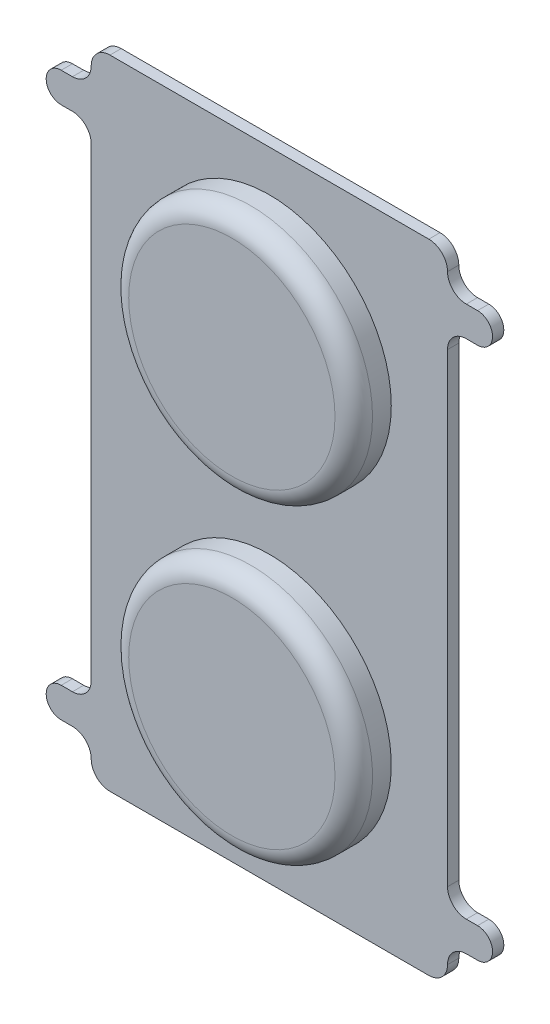
ISO-10303-21;
HEADER;
FILE_DESCRIPTION(('STEP AP214'),'2;1');
FILE_NAME('part.step','',(''),(''),'','','');
FILE_SCHEMA(('AUTOMOTIVE_DESIGN { 1 0 10303 214 1 1 1 1 }'));
ENDSEC;
DATA;
#1=APPLICATION_CONTEXT('core data for automotive mechanical design processes');
#2=APPLICATION_PROTOCOL_DEFINITION('international standard','automotive_design',2000,#1);
#3=PRODUCT_CONTEXT('',#1,'mechanical');
#4=PRODUCT('Part','Part','',(#3));
#5=PRODUCT_RELATED_PRODUCT_CATEGORY('part','',(#4));
#6=PRODUCT_DEFINITION_FORMATION('','',#4);
#7=PRODUCT_DEFINITION_CONTEXT('part definition',#1,'design');
#8=PRODUCT_DEFINITION('design','',#6,#7);
#9=PRODUCT_DEFINITION_SHAPE('','',#8);
#10=(LENGTH_UNIT() NAMED_UNIT(*) SI_UNIT(.MILLI.,.METRE.));
#11=(NAMED_UNIT(*) PLANE_ANGLE_UNIT() SI_UNIT($,.RADIAN.));
#12=(NAMED_UNIT(*) SI_UNIT($,.STERADIAN.) SOLID_ANGLE_UNIT());
#13=UNCERTAINTY_MEASURE_WITH_UNIT(LENGTH_MEASURE(1.E-05),#10,'distance_accuracy_value','');
#14=(GEOMETRIC_REPRESENTATION_CONTEXT(3) GLOBAL_UNCERTAINTY_ASSIGNED_CONTEXT((#13)) GLOBAL_UNIT_ASSIGNED_CONTEXT((#10,
#11,#12)) REPRESENTATION_CONTEXT('',''));
#15=CARTESIAN_POINT('',(0.,0.,0.));
#16=DIRECTION('',(0.,0.,1.));
#17=DIRECTION('',(1.,0.,0.));
#18=AXIS2_PLACEMENT_3D('',#15,#16,#17);
#19=CARTESIAN_POINT('',(-55.5,75.,3.));
#20=DIRECTION('',(0.,-1.,0.));
#21=DIRECTION('',(0.,0.,-1.));
#22=AXIS2_PLACEMENT_3D('',#19,#20,#21);
#23=PLANE('',#22);
#24=DIRECTION('',(-1.,0.,0.));
#25=VECTOR('',#24,1.);
#26=CARTESIAN_POINT('',(-55.5,75.,3.));
#27=LINE('',#26,#25);
#28=CARTESIAN_POINT('',(-52.5,75.,3.));
#29=VERTEX_POINT('',#28);
#30=CARTESIAN_POINT('',(-55.5,75.,3.));
#31=VERTEX_POINT('',#30);
#32=EDGE_CURVE('E222',#29,#31,#27,.T.);
#33=ORIENTED_EDGE('',*,*,#32,.F.);
#34=DIRECTION('',(0.,0.,-1.));
#35=VECTOR('',#34,1.);
#36=CARTESIAN_POINT('',(-52.5,75.,0.));
#37=LINE('',#36,#35);
#38=CARTESIAN_POINT('',(-52.5,75.,0.));
#39=VERTEX_POINT('',#38);
#40=EDGE_CURVE('E354',#29,#39,#37,.T.);
#41=ORIENTED_EDGE('',*,*,#40,.T.);
#42=DIRECTION('',(-1.,0.,0.));
#43=VECTOR('',#42,1.);
#44=CARTESIAN_POINT('',(-55.5,75.,0.));
#45=LINE('',#44,#43);
#46=CARTESIAN_POINT('',(-55.5,75.,0.));
#47=VERTEX_POINT('',#46);
#48=EDGE_CURVE('E240',#39,#47,#45,.T.);
#49=ORIENTED_EDGE('',*,*,#48,.T.);
#50=DIRECTION('',(0.,0.,-1.));
#51=VECTOR('',#50,1.);
#52=CARTESIAN_POINT('',(-55.5,75.,3.));
#53=LINE('',#52,#51);
#54=EDGE_CURVE('E238',#31,#47,#53,.T.);
#55=ORIENTED_EDGE('',*,*,#54,.F.);
#56=EDGE_LOOP('',(#33,#41,#49,#55));
#57=FACE_BOUND('',#56,.T.);
#58=ADVANCED_FACE('F38',(#57),#23,.F.);
#59=CARTESIAN_POINT('',(-55.5,71.,3.));
#60=DIRECTION('',(0.,0.,-1.));
#61=DIRECTION('',(-1.,0.,0.));
#62=AXIS2_PLACEMENT_3D('',#59,#60,#61);
#63=CYLINDRICAL_SURFACE('',#62,4.);
#64=CARTESIAN_POINT('',(-55.5,71.,0.));
#65=DIRECTION('',(0.,0.,1.));
#66=DIRECTION('',(-1.,0.,0.));
#67=AXIS2_PLACEMENT_3D('',#64,#65,#66);
#68=CIRCLE('',#67,4.);
#69=CARTESIAN_POINT('',(-55.5,67.,0.));
#70=VERTEX_POINT('',#69);
#71=EDGE_CURVE('E287',#47,#70,#68,.T.);
#72=ORIENTED_EDGE('',*,*,#71,.T.);
#73=DIRECTION('',(0.,0.,-1.));
#74=VECTOR('',#73,1.);
#75=CARTESIAN_POINT('',(-55.5,67.,3.));
#76=LINE('',#75,#74);
#77=CARTESIAN_POINT('',(-55.5,67.,3.));
#78=VERTEX_POINT('',#77);
#79=EDGE_CURVE('E244',#78,#70,#76,.T.);
#80=ORIENTED_EDGE('',*,*,#79,.F.);
#81=CARTESIAN_POINT('',(-55.5,71.,3.));
#82=DIRECTION('',(0.,0.,1.));
#83=DIRECTION('',(-1.,0.,0.));
#84=AXIS2_PLACEMENT_3D('',#81,#82,#83);
#85=CIRCLE('',#84,4.);
#86=EDGE_CURVE('E228',#31,#78,#85,.T.);
#87=ORIENTED_EDGE('',*,*,#86,.F.);
#88=ORIENTED_EDGE('',*,*,#54,.T.);
#89=EDGE_LOOP('',(#72,#80,#87,#88));
#90=FACE_BOUND('',#89,.T.);
#91=ADVANCED_FACE('F246',(#90),#63,.T.);
#92=CARTESIAN_POINT('',(-55.5,67.,3.));
#93=DIRECTION('',(0.,1.,0.));
#94=DIRECTION('',(0.,0.,1.));
#95=AXIS2_PLACEMENT_3D('',#92,#93,#94);
#96=PLANE('',#95);
#97=DIRECTION('',(1.,0.,0.));
#98=VECTOR('',#97,1.);
#99=CARTESIAN_POINT('',(-55.5,67.,0.));
#100=LINE('',#99,#98);
#101=CARTESIAN_POINT('',(-52.5,67.,0.));
#102=VERTEX_POINT('',#101);
#103=EDGE_CURVE('E290',#70,#102,#100,.T.);
#104=ORIENTED_EDGE('',*,*,#103,.T.);
#105=DIRECTION('',(0.,0.,-1.));
#106=VECTOR('',#105,1.);
#107=CARTESIAN_POINT('',(-52.5,67.,3.));
#108=LINE('',#107,#106);
#109=CARTESIAN_POINT('',(-52.5,67.,3.));
#110=VERTEX_POINT('',#109);
#111=EDGE_CURVE('E352',#102,#110,#108,.F.);
#112=ORIENTED_EDGE('',*,*,#111,.T.);
#113=DIRECTION('',(1.,0.,0.));
#114=VECTOR('',#113,1.);
#115=CARTESIAN_POINT('',(-55.5,67.,3.));
#116=LINE('',#115,#114);
#117=EDGE_CURVE('E249',#78,#110,#116,.T.);
#118=ORIENTED_EDGE('',*,*,#117,.F.);
#119=ORIENTED_EDGE('',*,*,#79,.T.);
#120=EDGE_LOOP('',(#104,#112,#118,#119));
#121=FACE_BOUND('',#120,.T.);
#122=ADVANCED_FACE('F464',(#121),#96,.F.);
#123=CARTESIAN_POINT('',(-47.5,67.,3.));
#124=DIRECTION('',(1.,0.,0.));
#125=DIRECTION('',(0.,0.,-1.));
#126=AXIS2_PLACEMENT_3D('',#123,#124,#125);
#127=PLANE('',#126);
#128=DIRECTION('',(0.,-1.,0.));
#129=VECTOR('',#128,1.);
#130=CARTESIAN_POINT('',(-47.5,67.,0.));
#131=LINE('',#130,#129);
#132=CARTESIAN_POINT('',(-47.5,62.,0.));
#133=VERTEX_POINT('',#132);
#134=CARTESIAN_POINT('',(-47.5,-62.,0.));
#135=VERTEX_POINT('',#134);
#136=EDGE_CURVE('E293',#133,#135,#131,.T.);
#137=ORIENTED_EDGE('',*,*,#136,.T.);
#138=DIRECTION('',(0.,0.,-1.));
#139=VECTOR('',#138,1.);
#140=CARTESIAN_POINT('',(-47.5,-62.,3.));
#141=LINE('',#140,#139);
#142=CARTESIAN_POINT('',(-47.5,-62.,3.));
#143=VERTEX_POINT('',#142);
#144=EDGE_CURVE('E347',#135,#143,#141,.F.);
#145=ORIENTED_EDGE('',*,*,#144,.T.);
#146=DIRECTION('',(0.,-1.,0.));
#147=VECTOR('',#146,1.);
#148=CARTESIAN_POINT('',(-47.5,67.,3.));
#149=LINE('',#148,#147);
#150=CARTESIAN_POINT('',(-47.5,62.,3.));
#151=VERTEX_POINT('',#150);
#152=EDGE_CURVE('E251',#151,#143,#149,.T.);
#153=ORIENTED_EDGE('',*,*,#152,.F.);
#154=DIRECTION('',(0.,0.,-1.));
#155=VECTOR('',#154,1.);
#156=CARTESIAN_POINT('',(-47.5,62.,0.));
#157=LINE('',#156,#155);
#158=EDGE_CURVE('E344',#151,#133,#157,.T.);
#159=ORIENTED_EDGE('',*,*,#158,.T.);
#160=EDGE_LOOP('',(#137,#145,#153,#159));
#161=FACE_BOUND('',#160,.T.);
#162=ADVANCED_FACE('F581',(#161),#127,.F.);
#163=CARTESIAN_POINT('',(-55.5,-67.,3.));
#164=DIRECTION('',(0.,-1.,0.));
#165=DIRECTION('',(0.,0.,-1.));
#166=AXIS2_PLACEMENT_3D('',#163,#164,#165);
#167=PLANE('',#166);
#168=DIRECTION('',(-1.,0.,0.));
#169=VECTOR('',#168,1.);
#170=CARTESIAN_POINT('',(-55.5,-67.,3.));
#171=LINE('',#170,#169);
#172=CARTESIAN_POINT('',(-52.5,-67.,3.));
#173=VERTEX_POINT('',#172);
#174=CARTESIAN_POINT('',(-55.5,-67.,3.));
#175=VERTEX_POINT('',#174);
#176=EDGE_CURVE('E257',#173,#175,#171,.T.);
#177=ORIENTED_EDGE('',*,*,#176,.F.);
#178=DIRECTION('',(0.,0.,-1.));
#179=VECTOR('',#178,1.);
#180=CARTESIAN_POINT('',(-52.5,-67.,0.));
#181=LINE('',#180,#179);
#182=CARTESIAN_POINT('',(-52.5,-67.,0.));
#183=VERTEX_POINT('',#182);
#184=EDGE_CURVE('E243',#173,#183,#181,.T.);
#185=ORIENTED_EDGE('',*,*,#184,.T.);
#186=DIRECTION('',(-1.,0.,0.));
#187=VECTOR('',#186,1.);
#188=CARTESIAN_POINT('',(-55.5,-67.,0.));
#189=LINE('',#188,#187);
#190=CARTESIAN_POINT('',(-55.5,-67.,0.));
#191=VERTEX_POINT('',#190);
#192=EDGE_CURVE('E296',#183,#191,#189,.T.);
#193=ORIENTED_EDGE('',*,*,#192,.T.);
#194=DIRECTION('',(0.,0.,-1.));
#195=VECTOR('',#194,1.);
#196=CARTESIAN_POINT('',(-55.5,-67.,3.));
#197=LINE('',#196,#195);
#198=EDGE_CURVE('E338',#175,#191,#197,.T.);
#199=ORIENTED_EDGE('',*,*,#198,.F.);
#200=EDGE_LOOP('',(#177,#185,#193,#199));
#201=FACE_BOUND('',#200,.T.);
#202=ADVANCED_FACE('F589',(#201),#167,.F.);
#203=CARTESIAN_POINT('',(-55.5,-71.,3.));
#204=DIRECTION('',(0.,0.,-1.));
#205=DIRECTION('',(-1.,0.,0.));
#206=AXIS2_PLACEMENT_3D('',#203,#204,#205);
#207=CYLINDRICAL_SURFACE('',#206,4.);
#208=CARTESIAN_POINT('',(-55.5,-71.,0.));
#209=DIRECTION('',(0.,0.,1.));
#210=DIRECTION('',(1.,0.,0.));
#211=AXIS2_PLACEMENT_3D('',#208,#209,#210);
#212=CIRCLE('',#211,4.);
#213=CARTESIAN_POINT('',(-55.5,-75.,0.));
#214=VERTEX_POINT('',#213);
#215=EDGE_CURVE('E298',#191,#214,#212,.T.);
#216=ORIENTED_EDGE('',*,*,#215,.T.);
#217=DIRECTION('',(0.,0.,-1.));
#218=VECTOR('',#217,1.);
#219=CARTESIAN_POINT('',(-55.5,-75.,3.));
#220=LINE('',#219,#218);
#221=CARTESIAN_POINT('',(-55.5,-75.,3.));
#222=VERTEX_POINT('',#221);
#223=EDGE_CURVE('E335',#222,#214,#220,.T.);
#224=ORIENTED_EDGE('',*,*,#223,.F.);
#225=CARTESIAN_POINT('',(-55.5,-71.,3.));
#226=DIRECTION('',(0.,0.,1.));
#227=DIRECTION('',(1.,0.,0.));
#228=AXIS2_PLACEMENT_3D('',#225,#226,#227);
#229=CIRCLE('',#228,4.);
#230=EDGE_CURVE('E259',#175,#222,#229,.T.);
#231=ORIENTED_EDGE('',*,*,#230,.F.);
#232=ORIENTED_EDGE('',*,*,#198,.T.);
#233=EDGE_LOOP('',(#216,#224,#231,#232));
#234=FACE_BOUND('',#233,.T.);
#235=ADVANCED_FACE('F595',(#234),#207,.T.);
#236=CARTESIAN_POINT('',(-55.5,-75.,3.));
#237=DIRECTION('',(0.,1.,0.));
#238=DIRECTION('',(0.,0.,1.));
#239=AXIS2_PLACEMENT_3D('',#236,#237,#238);
#240=PLANE('',#239);
#241=DIRECTION('',(1.,0.,0.));
#242=VECTOR('',#241,1.);
#243=CARTESIAN_POINT('',(-55.5,-75.,0.));
#244=LINE('',#243,#242);
#245=CARTESIAN_POINT('',(-52.5,-75.,0.));
#246=VERTEX_POINT('',#245);
#247=EDGE_CURVE('E300',#214,#246,#244,.T.);
#248=ORIENTED_EDGE('',*,*,#247,.T.);
#249=DIRECTION('',(0.,0.,-1.));
#250=VECTOR('',#249,1.);
#251=CARTESIAN_POINT('',(-52.5,-75.,3.));
#252=LINE('',#251,#250);
#253=CARTESIAN_POINT('',(-52.5,-75.,3.));
#254=VERTEX_POINT('',#253);
#255=EDGE_CURVE('E349',#246,#254,#252,.F.);
#256=ORIENTED_EDGE('',*,*,#255,.T.);
#257=DIRECTION('',(1.,0.,0.));
#258=VECTOR('',#257,1.);
#259=CARTESIAN_POINT('',(-55.5,-75.,3.));
#260=LINE('',#259,#258);
#261=EDGE_CURVE('E261',#222,#254,#260,.T.);
#262=ORIENTED_EDGE('',*,*,#261,.F.);
#263=ORIENTED_EDGE('',*,*,#223,.T.);
#264=EDGE_LOOP('',(#248,#256,#262,#263));
#265=FACE_BOUND('',#264,.T.);
#266=ADVANCED_FACE('F598',(#265),#240,.F.);
#267=CARTESIAN_POINT('',(-47.5,-85.,3.));
#268=DIRECTION('',(0.,1.,0.));
#269=DIRECTION('',(0.,0.,1.));
#270=AXIS2_PLACEMENT_3D('',#267,#268,#269);
#271=PLANE('',#270);
#272=DIRECTION('',(1.,0.,0.));
#273=VECTOR('',#272,1.);
#274=CARTESIAN_POINT('',(-47.5,-85.,0.));
#275=LINE('',#274,#273);
#276=CARTESIAN_POINT('',(-42.5,-85.,0.));
#277=VERTEX_POINT('',#276);
#278=CARTESIAN_POINT('',(42.5,-85.,0.));
#279=VERTEX_POINT('',#278);
#280=EDGE_CURVE('E303',#277,#279,#275,.T.);
#281=ORIENTED_EDGE('',*,*,#280,.T.);
#282=DIRECTION('',(0.,0.,-1.));
#283=VECTOR('',#282,1.);
#284=CARTESIAN_POINT('',(42.5,-85.,3.));
#285=LINE('',#284,#283);
#286=CARTESIAN_POINT('',(42.5,-85.,3.));
#287=VERTEX_POINT('',#286);
#288=EDGE_CURVE('E382',#279,#287,#285,.F.);
#289=ORIENTED_EDGE('',*,*,#288,.T.);
#290=DIRECTION('',(1.,0.,0.));
#291=VECTOR('',#290,1.);
#292=CARTESIAN_POINT('',(-47.5,-85.,3.));
#293=LINE('',#292,#291);
#294=CARTESIAN_POINT('',(-42.5,-85.,3.));
#295=VERTEX_POINT('',#294);
#296=EDGE_CURVE('E264',#295,#287,#293,.T.);
#297=ORIENTED_EDGE('',*,*,#296,.F.);
#298=DIRECTION('',(0.,0.,-1.));
#299=VECTOR('',#298,1.);
#300=CARTESIAN_POINT('',(-42.5,-85.,3.));
#301=LINE('',#300,#299);
#302=EDGE_CURVE('E380',#295,#277,#301,.T.);
#303=ORIENTED_EDGE('',*,*,#302,.T.);
#304=EDGE_LOOP('',(#281,#289,#297,#303));
#305=FACE_BOUND('',#304,.T.);
#306=ADVANCED_FACE('F608',(#305),#271,.F.);
#307=CARTESIAN_POINT('',(55.5,-75.,3.));
#308=DIRECTION('',(0.,1.,0.));
#309=DIRECTION('',(0.,0.,1.));
#310=AXIS2_PLACEMENT_3D('',#307,#308,#309);
#311=PLANE('',#310);
#312=DIRECTION('',(1.,0.,0.));
#313=VECTOR('',#312,1.);
#314=CARTESIAN_POINT('',(55.5,-75.,3.));
#315=LINE('',#314,#313);
#316=CARTESIAN_POINT('',(52.5,-75.,3.));
#317=VERTEX_POINT('',#316);
#318=CARTESIAN_POINT('',(55.5,-75.,3.));
#319=VERTEX_POINT('',#318);
#320=EDGE_CURVE('E266',#317,#319,#315,.T.);
#321=ORIENTED_EDGE('',*,*,#320,.F.);
#322=DIRECTION('',(0.,0.,-1.));
#323=VECTOR('',#322,1.);
#324=CARTESIAN_POINT('',(52.5,-75.,0.));
#325=LINE('',#324,#323);
#326=CARTESIAN_POINT('',(52.5,-75.,0.));
#327=VERTEX_POINT('',#326);
#328=EDGE_CURVE('E369',#317,#327,#325,.T.);
#329=ORIENTED_EDGE('',*,*,#328,.T.);
#330=DIRECTION('',(1.,0.,0.));
#331=VECTOR('',#330,1.);
#332=CARTESIAN_POINT('',(55.5,-75.,0.));
#333=LINE('',#332,#331);
#334=CARTESIAN_POINT('',(55.5,-75.,0.));
#335=VERTEX_POINT('',#334);
#336=EDGE_CURVE('E306',#327,#335,#333,.T.);
#337=ORIENTED_EDGE('',*,*,#336,.T.);
#338=DIRECTION('',(0.,0.,-1.));
#339=VECTOR('',#338,1.);
#340=CARTESIAN_POINT('',(55.5,-75.,3.));
#341=LINE('',#340,#339);
#342=EDGE_CURVE('E332',#319,#335,#341,.T.);
#343=ORIENTED_EDGE('',*,*,#342,.F.);
#344=EDGE_LOOP('',(#321,#329,#337,#343));
#345=FACE_BOUND('',#344,.T.);
#346=ADVANCED_FACE('F528',(#345),#311,.F.);
#347=CARTESIAN_POINT('',(55.5,-71.,3.));
#348=DIRECTION('',(0.,0.,-1.));
#349=DIRECTION('',(-1.,0.,0.));
#350=AXIS2_PLACEMENT_3D('',#347,#348,#349);
#351=CYLINDRICAL_SURFACE('',#350,4.);
#352=CARTESIAN_POINT('',(55.5,-71.,0.));
#353=DIRECTION('',(0.,0.,1.));
#354=DIRECTION('',(-1.,0.,0.));
#355=AXIS2_PLACEMENT_3D('',#352,#353,#354);
#356=CIRCLE('',#355,4.);
#357=CARTESIAN_POINT('',(55.5,-67.,0.));
#358=VERTEX_POINT('',#357);
#359=EDGE_CURVE('E308',#335,#358,#356,.T.);
#360=ORIENTED_EDGE('',*,*,#359,.T.);
#361=DIRECTION('',(0.,0.,-1.));
#362=VECTOR('',#361,1.);
#363=CARTESIAN_POINT('',(55.5,-67.,3.));
#364=LINE('',#363,#362);
#365=CARTESIAN_POINT('',(55.5,-67.,3.));
#366=VERTEX_POINT('',#365);
#367=EDGE_CURVE('E329',#366,#358,#364,.T.);
#368=ORIENTED_EDGE('',*,*,#367,.F.);
#369=CARTESIAN_POINT('',(55.5,-71.,3.));
#370=DIRECTION('',(0.,0.,1.));
#371=DIRECTION('',(-1.,0.,0.));
#372=AXIS2_PLACEMENT_3D('',#369,#370,#371);
#373=CIRCLE('',#372,4.);
#374=EDGE_CURVE('E268',#319,#366,#373,.T.);
#375=ORIENTED_EDGE('',*,*,#374,.F.);
#376=ORIENTED_EDGE('',*,*,#342,.T.);
#377=EDGE_LOOP('',(#360,#368,#375,#376));
#378=FACE_BOUND('',#377,.T.);
#379=ADVANCED_FACE('F534',(#378),#351,.T.);
#380=CARTESIAN_POINT('',(55.5,-67.,3.));
#381=DIRECTION('',(0.,-1.,0.));
#382=DIRECTION('',(0.,0.,-1.));
#383=AXIS2_PLACEMENT_3D('',#380,#381,#382);
#384=PLANE('',#383);
#385=DIRECTION('',(-1.,0.,0.));
#386=VECTOR('',#385,1.);
#387=CARTESIAN_POINT('',(55.5,-67.,0.));
#388=LINE('',#387,#386);
#389=CARTESIAN_POINT('',(52.5,-67.,0.));
#390=VERTEX_POINT('',#389);
#391=EDGE_CURVE('E310',#358,#390,#388,.T.);
#392=ORIENTED_EDGE('',*,*,#391,.T.);
#393=DIRECTION('',(0.,0.,-1.));
#394=VECTOR('',#393,1.);
#395=CARTESIAN_POINT('',(52.5,-67.,3.));
#396=LINE('',#395,#394);
#397=CARTESIAN_POINT('',(52.5,-67.,3.));
#398=VERTEX_POINT('',#397);
#399=EDGE_CURVE('E367',#390,#398,#396,.F.);
#400=ORIENTED_EDGE('',*,*,#399,.T.);
#401=DIRECTION('',(-1.,0.,0.));
#402=VECTOR('',#401,1.);
#403=CARTESIAN_POINT('',(55.5,-67.,3.));
#404=LINE('',#403,#402);
#405=EDGE_CURVE('E270',#366,#398,#404,.T.);
#406=ORIENTED_EDGE('',*,*,#405,.F.);
#407=ORIENTED_EDGE('',*,*,#367,.T.);
#408=EDGE_LOOP('',(#392,#400,#406,#407));
#409=FACE_BOUND('',#408,.T.);
#410=ADVANCED_FACE('F609',(#409),#384,.F.);
#411=CARTESIAN_POINT('',(47.5,67.,3.));
#412=DIRECTION('',(-1.,0.,0.));
#413=DIRECTION('',(0.,0.,1.));
#414=AXIS2_PLACEMENT_3D('',#411,#412,#413);
#415=PLANE('',#414);
#416=DIRECTION('',(0.,1.,0.));
#417=VECTOR('',#416,1.);
#418=CARTESIAN_POINT('',(47.5,67.,0.));
#419=LINE('',#418,#417);
#420=CARTESIAN_POINT('',(47.5,-62.,0.));
#421=VERTEX_POINT('',#420);
#422=CARTESIAN_POINT('',(47.5,62.,0.));
#423=VERTEX_POINT('',#422);
#424=EDGE_CURVE('E313',#421,#423,#419,.T.);
#425=ORIENTED_EDGE('',*,*,#424,.T.);
#426=DIRECTION('',(0.,0.,-1.));
#427=VECTOR('',#426,1.);
#428=CARTESIAN_POINT('',(47.5,62.,3.));
#429=LINE('',#428,#427);
#430=CARTESIAN_POINT('',(47.5,62.,3.));
#431=VERTEX_POINT('',#430);
#432=EDGE_CURVE('E362',#423,#431,#429,.F.);
#433=ORIENTED_EDGE('',*,*,#432,.T.);
#434=DIRECTION('',(0.,1.,0.));
#435=VECTOR('',#434,1.);
#436=CARTESIAN_POINT('',(47.5,67.,3.));
#437=LINE('',#436,#435);
#438=CARTESIAN_POINT('',(47.5,-62.,3.));
#439=VERTEX_POINT('',#438);
#440=EDGE_CURVE('E273',#439,#431,#437,.T.);
#441=ORIENTED_EDGE('',*,*,#440,.F.);
#442=DIRECTION('',(0.,0.,-1.));
#443=VECTOR('',#442,1.);
#444=CARTESIAN_POINT('',(47.5,-62.,0.));
#445=LINE('',#444,#443);
#446=EDGE_CURVE('E359',#439,#421,#445,.T.);
#447=ORIENTED_EDGE('',*,*,#446,.T.);
#448=EDGE_LOOP('',(#425,#433,#441,#447));
#449=FACE_BOUND('',#448,.T.);
#450=ADVANCED_FACE('F543',(#449),#415,.F.);
#451=CARTESIAN_POINT('',(55.5,67.,3.));
#452=DIRECTION('',(0.,1.,0.));
#453=DIRECTION('',(0.,0.,1.));
#454=AXIS2_PLACEMENT_3D('',#451,#452,#453);
#455=PLANE('',#454);
#456=DIRECTION('',(1.,0.,0.));
#457=VECTOR('',#456,1.);
#458=CARTESIAN_POINT('',(55.5,67.,3.));
#459=LINE('',#458,#457);
#460=CARTESIAN_POINT('',(52.5,67.,3.));
#461=VERTEX_POINT('',#460);
#462=CARTESIAN_POINT('',(55.5,67.,3.));
#463=VERTEX_POINT('',#462);
#464=EDGE_CURVE('E276',#461,#463,#459,.T.);
#465=ORIENTED_EDGE('',*,*,#464,.F.);
#466=DIRECTION('',(0.,0.,-1.));
#467=VECTOR('',#466,1.);
#468=CARTESIAN_POINT('',(52.5,67.,0.));
#469=LINE('',#468,#467);
#470=CARTESIAN_POINT('',(52.5,67.,0.));
#471=VERTEX_POINT('',#470);
#472=EDGE_CURVE('E356',#461,#471,#469,.T.);
#473=ORIENTED_EDGE('',*,*,#472,.T.);
#474=DIRECTION('',(1.,0.,0.));
#475=VECTOR('',#474,1.);
#476=CARTESIAN_POINT('',(55.5,67.,0.));
#477=LINE('',#476,#475);
#478=CARTESIAN_POINT('',(55.5,67.,0.));
#479=VERTEX_POINT('',#478);
#480=EDGE_CURVE('E316',#471,#479,#477,.T.);
#481=ORIENTED_EDGE('',*,*,#480,.T.);
#482=DIRECTION('',(0.,0.,-1.));
#483=VECTOR('',#482,1.);
#484=CARTESIAN_POINT('',(55.5,67.,3.));
#485=LINE('',#484,#483);
#486=EDGE_CURVE('E326',#463,#479,#485,.T.);
#487=ORIENTED_EDGE('',*,*,#486,.F.);
#488=EDGE_LOOP('',(#465,#473,#481,#487));
#489=FACE_BOUND('',#488,.T.);
#490=ADVANCED_FACE('F553',(#489),#455,.F.);
#491=CARTESIAN_POINT('',(55.5,71.,3.));
#492=DIRECTION('',(0.,0.,-1.));
#493=DIRECTION('',(-1.,0.,0.));
#494=AXIS2_PLACEMENT_3D('',#491,#492,#493);
#495=CYLINDRICAL_SURFACE('',#494,4.);
#496=CARTESIAN_POINT('',(55.5,71.,0.));
#497=DIRECTION('',(0.,0.,1.));
#498=DIRECTION('',(1.,0.,0.));
#499=AXIS2_PLACEMENT_3D('',#496,#497,#498);
#500=CIRCLE('',#499,4.);
#501=CARTESIAN_POINT('',(55.5,75.,0.));
#502=VERTEX_POINT('',#501);
#503=EDGE_CURVE('E318',#479,#502,#500,.T.);
#504=ORIENTED_EDGE('',*,*,#503,.T.);
#505=DIRECTION('',(0.,0.,-1.));
#506=VECTOR('',#505,1.);
#507=CARTESIAN_POINT('',(55.5,75.,3.));
#508=LINE('',#507,#506);
#509=CARTESIAN_POINT('',(55.5,75.,3.));
#510=VERTEX_POINT('',#509);
#511=EDGE_CURVE('E285',#510,#502,#508,.T.);
#512=ORIENTED_EDGE('',*,*,#511,.F.);
#513=CARTESIAN_POINT('',(55.5,71.,3.));
#514=DIRECTION('',(0.,0.,1.));
#515=DIRECTION('',(1.,0.,0.));
#516=AXIS2_PLACEMENT_3D('',#513,#514,#515);
#517=CIRCLE('',#516,4.);
#518=EDGE_CURVE('E278',#463,#510,#517,.T.);
#519=ORIENTED_EDGE('',*,*,#518,.F.);
#520=ORIENTED_EDGE('',*,*,#486,.T.);
#521=EDGE_LOOP('',(#504,#512,#519,#520));
#522=FACE_BOUND('',#521,.T.);
#523=ADVANCED_FACE('F559',(#522),#495,.T.);
#524=CARTESIAN_POINT('',(55.5,75.,3.));
#525=DIRECTION('',(0.,-1.,0.));
#526=DIRECTION('',(0.,0.,-1.));
#527=AXIS2_PLACEMENT_3D('',#524,#525,#526);
#528=PLANE('',#527);
#529=DIRECTION('',(-1.,0.,0.));
#530=VECTOR('',#529,1.);
#531=CARTESIAN_POINT('',(55.5,75.,0.));
#532=LINE('',#531,#530);
#533=CARTESIAN_POINT('',(52.5,75.,0.));
#534=VERTEX_POINT('',#533);
#535=EDGE_CURVE('E320',#502,#534,#532,.T.);
#536=ORIENTED_EDGE('',*,*,#535,.T.);
#537=DIRECTION('',(0.,0.,-1.));
#538=VECTOR('',#537,1.);
#539=CARTESIAN_POINT('',(52.5,75.,3.));
#540=LINE('',#539,#538);
#541=CARTESIAN_POINT('',(52.5,75.,3.));
#542=VERTEX_POINT('',#541);
#543=EDGE_CURVE('E364',#534,#542,#540,.F.);
#544=ORIENTED_EDGE('',*,*,#543,.T.);
#545=DIRECTION('',(-1.,0.,0.));
#546=VECTOR('',#545,1.);
#547=CARTESIAN_POINT('',(55.5,75.,3.));
#548=LINE('',#547,#546);
#549=EDGE_CURVE('E280',#510,#542,#548,.T.);
#550=ORIENTED_EDGE('',*,*,#549,.F.);
#551=ORIENTED_EDGE('',*,*,#511,.T.);
#552=EDGE_LOOP('',(#536,#544,#550,#551));
#553=FACE_BOUND('',#552,.T.);
#554=ADVANCED_FACE('F562',(#553),#528,.F.);
#555=CARTESIAN_POINT('',(-47.5,85.,3.));
#556=DIRECTION('',(0.,-1.,0.));
#557=DIRECTION('',(0.,0.,-1.));
#558=AXIS2_PLACEMENT_3D('',#555,#556,#557);
#559=PLANE('',#558);
#560=DIRECTION('',(-1.,0.,0.));
#561=VECTOR('',#560,1.);
#562=CARTESIAN_POINT('',(-47.5,85.,0.));
#563=LINE('',#562,#561);
#564=CARTESIAN_POINT('',(42.5,85.,0.));
#565=VERTEX_POINT('',#564);
#566=CARTESIAN_POINT('',(-42.5,85.,0.));
#567=VERTEX_POINT('',#566);
#568=EDGE_CURVE('E235',#565,#567,#563,.T.);
#569=ORIENTED_EDGE('',*,*,#568,.T.);
#570=DIRECTION('',(0.,0.,-1.));
#571=VECTOR('',#570,1.);
#572=CARTESIAN_POINT('',(-42.5,85.,3.));
#573=LINE('',#572,#571);
#574=CARTESIAN_POINT('',(-42.5,85.,3.));
#575=VERTEX_POINT('',#574);
#576=EDGE_CURVE('E53',#567,#575,#573,.F.);
#577=ORIENTED_EDGE('',*,*,#576,.T.);
#578=DIRECTION('',(-1.,0.,0.));
#579=VECTOR('',#578,1.);
#580=CARTESIAN_POINT('',(-47.5,85.,3.));
#581=LINE('',#580,#579);
#582=CARTESIAN_POINT('',(42.5,85.,3.));
#583=VERTEX_POINT('',#582);
#584=EDGE_CURVE('E283',#583,#575,#581,.T.);
#585=ORIENTED_EDGE('',*,*,#584,.F.);
#586=DIRECTION('',(0.,0.,-1.));
#587=VECTOR('',#586,1.);
#588=CARTESIAN_POINT('',(42.5,85.,3.));
#589=LINE('',#588,#587);
#590=EDGE_CURVE('E391',#583,#565,#589,.T.);
#591=ORIENTED_EDGE('',*,*,#590,.T.);
#592=EDGE_LOOP('',(#569,#577,#585,#591));
#593=FACE_BOUND('',#592,.T.);
#594=ADVANCED_FACE('F569',(#593),#559,.F.);
#595=CARTESIAN_POINT('',(-55.5,71.,3.));
#596=DIRECTION('',(0.,0.,-1.));
#597=DIRECTION('',(-1.,0.,0.));
#598=AXIS2_PLACEMENT_3D('',#595,#596,#597);
#599=PLANE('',#598);
#600=CARTESIAN_POINT('',(0.,-41.5,3.));
#601=DIRECTION('',(0.,0.,-1.));
#602=DIRECTION('',(-1.,0.,0.));
#603=AXIS2_PLACEMENT_3D('',#600,#601,#602);
#604=CIRCLE('',#603,32.5);
#605=CARTESIAN_POINT('',(-32.5,-41.5,3.));
#606=VERTEX_POINT('',#605);
#607=EDGE_CURVE('E437',#606,#606,#604,.F.);
#608=ORIENTED_EDGE('',*,*,#607,.F.);
#609=EDGE_LOOP('',(#608));
#610=FACE_BOUND('',#609,.T.);
#611=CARTESIAN_POINT('',(0.,41.5,3.));
#612=DIRECTION('',(0.,0.,1.));
#613=DIRECTION('',(1.,0.,0.));
#614=AXIS2_PLACEMENT_3D('',#611,#612,#613);
#615=CIRCLE('',#614,32.5);
#616=CARTESIAN_POINT('',(32.5,41.5,3.));
#617=VERTEX_POINT('',#616);
#618=EDGE_CURVE('E425',#617,#617,#615,.T.);
#619=ORIENTED_EDGE('',*,*,#618,.F.);
#620=EDGE_LOOP('',(#619));
#621=FACE_BOUND('',#620,.T.);
#622=ORIENTED_EDGE('',*,*,#296,.T.);
#623=CARTESIAN_POINT('',(42.5,-80.,3.));
#624=DIRECTION('',(0.,0.,-1.));
#625=DIRECTION('',(-1.,0.,0.));
#626=AXIS2_PLACEMENT_3D('',#623,#624,#625);
#627=CIRCLE('',#626,5.);
#628=CARTESIAN_POINT('',(47.5,-80.,3.));
#629=VERTEX_POINT('',#628);
#630=EDGE_CURVE('E389',#287,#629,#627,.F.);
#631=ORIENTED_EDGE('',*,*,#630,.T.);
#632=CARTESIAN_POINT('',(52.5,-80.,3.));
#633=DIRECTION('',(0.,0.,-1.));
#634=DIRECTION('',(-1.,0.,0.));
#635=AXIS2_PLACEMENT_3D('',#632,#633,#634);
#636=CIRCLE('',#635,5.);
#637=EDGE_CURVE('E423',#629,#317,#636,.T.);
#638=ORIENTED_EDGE('',*,*,#637,.T.);
#639=ORIENTED_EDGE('',*,*,#320,.T.);
#640=ORIENTED_EDGE('',*,*,#374,.T.);
#641=ORIENTED_EDGE('',*,*,#405,.T.);
#642=CARTESIAN_POINT('',(52.5,-62.,3.));
#643=DIRECTION('',(0.,0.,-1.));
#644=DIRECTION('',(-1.,0.,0.));
#645=AXIS2_PLACEMENT_3D('',#642,#643,#644);
#646=CIRCLE('',#645,5.);
#647=EDGE_CURVE('E419',#398,#439,#646,.T.);
#648=ORIENTED_EDGE('',*,*,#647,.T.);
#649=ORIENTED_EDGE('',*,*,#440,.T.);
#650=CARTESIAN_POINT('',(52.5,62.,3.));
#651=DIRECTION('',(0.,0.,-1.));
#652=DIRECTION('',(-1.,0.,0.));
#653=AXIS2_PLACEMENT_3D('',#650,#651,#652);
#654=CIRCLE('',#653,5.);
#655=EDGE_CURVE('E411',#431,#461,#654,.T.);
#656=ORIENTED_EDGE('',*,*,#655,.T.);
#657=ORIENTED_EDGE('',*,*,#464,.T.);
#658=ORIENTED_EDGE('',*,*,#518,.T.);
#659=ORIENTED_EDGE('',*,*,#549,.T.);
#660=CARTESIAN_POINT('',(52.5,80.,3.));
#661=DIRECTION('',(0.,0.,-1.));
#662=DIRECTION('',(-1.,0.,0.));
#663=AXIS2_PLACEMENT_3D('',#660,#661,#662);
#664=CIRCLE('',#663,5.);
#665=CARTESIAN_POINT('',(47.5,80.,3.));
#666=VERTEX_POINT('',#665);
#667=EDGE_CURVE('E415',#542,#666,#664,.T.);
#668=ORIENTED_EDGE('',*,*,#667,.T.);
#669=CARTESIAN_POINT('',(42.5,80.,3.));
#670=DIRECTION('',(0.,0.,-1.));
#671=DIRECTION('',(-1.,0.,0.));
#672=AXIS2_PLACEMENT_3D('',#669,#670,#671);
#673=CIRCLE('',#672,5.);
#674=EDGE_CURVE('E60',#666,#583,#673,.F.);
#675=ORIENTED_EDGE('',*,*,#674,.T.);
#676=ORIENTED_EDGE('',*,*,#584,.T.);
#677=CARTESIAN_POINT('',(-42.5,80.,3.));
#678=DIRECTION('',(0.,0.,-1.));
#679=DIRECTION('',(-1.,0.,0.));
#680=AXIS2_PLACEMENT_3D('',#677,#678,#679);
#681=CIRCLE('',#680,5.);
#682=CARTESIAN_POINT('',(-47.5,80.,3.));
#683=VERTEX_POINT('',#682);
#684=EDGE_CURVE('E385',#575,#683,#681,.F.);
#685=ORIENTED_EDGE('',*,*,#684,.T.);
#686=CARTESIAN_POINT('',(-52.5,80.,3.));
#687=DIRECTION('',(0.,0.,-1.));
#688=DIRECTION('',(-1.,0.,0.));
#689=AXIS2_PLACEMENT_3D('',#686,#687,#688);
#690=CIRCLE('',#689,5.);
#691=EDGE_CURVE('E231',#683,#29,#690,.T.);
#692=ORIENTED_EDGE('',*,*,#691,.T.);
#693=ORIENTED_EDGE('',*,*,#32,.T.);
#694=ORIENTED_EDGE('',*,*,#86,.T.);
#695=ORIENTED_EDGE('',*,*,#117,.T.);
#696=CARTESIAN_POINT('',(-52.5,62.,3.));
#697=DIRECTION('',(0.,0.,-1.));
#698=DIRECTION('',(-1.,0.,0.));
#699=AXIS2_PLACEMENT_3D('',#696,#697,#698);
#700=CIRCLE('',#699,5.);
#701=EDGE_CURVE('E404',#110,#151,#700,.T.);
#702=ORIENTED_EDGE('',*,*,#701,.T.);
#703=ORIENTED_EDGE('',*,*,#152,.T.);
#704=CARTESIAN_POINT('',(-52.5,-62.,3.));
#705=DIRECTION('',(0.,0.,-1.));
#706=DIRECTION('',(-1.,0.,0.));
#707=AXIS2_PLACEMENT_3D('',#704,#705,#706);
#708=CIRCLE('',#707,5.);
#709=EDGE_CURVE('E396',#143,#173,#708,.T.);
#710=ORIENTED_EDGE('',*,*,#709,.T.);
#711=ORIENTED_EDGE('',*,*,#176,.T.);
#712=ORIENTED_EDGE('',*,*,#230,.T.);
#713=ORIENTED_EDGE('',*,*,#261,.T.);
#714=CARTESIAN_POINT('',(-52.5,-80.,3.));
#715=DIRECTION('',(0.,0.,-1.));
#716=DIRECTION('',(-1.,0.,0.));
#717=AXIS2_PLACEMENT_3D('',#714,#715,#716);
#718=CIRCLE('',#717,5.);
#719=CARTESIAN_POINT('',(-47.5,-80.,3.));
#720=VERTEX_POINT('',#719);
#721=EDGE_CURVE('E400',#254,#720,#718,.T.);
#722=ORIENTED_EDGE('',*,*,#721,.T.);
#723=CARTESIAN_POINT('',(-42.5,-80.,3.));
#724=DIRECTION('',(0.,0.,-1.));
#725=DIRECTION('',(-1.,0.,0.));
#726=AXIS2_PLACEMENT_3D('',#723,#724,#725);
#727=CIRCLE('',#726,5.);
#728=EDGE_CURVE('E387',#720,#295,#727,.F.);
#729=ORIENTED_EDGE('',*,*,#728,.T.);
#730=EDGE_LOOP('',(#622,#631,#638,#639,#640,#641,#648,#649,#656,#657,#658,#659,#668,#675,#676,
#685,#692,#693,#694,#695,#702,#703,#710,#711,#712,#713,#722,#729));
#731=FACE_BOUND('',#730,.T.);
#732=ADVANCED_FACE('F225',(#610,#621,#731),#599,.F.);
#733=CARTESIAN_POINT('',(-55.5,71.,0.));
#734=DIRECTION('',(0.,0.,-1.));
#735=DIRECTION('',(-1.,0.,0.));
#736=AXIS2_PLACEMENT_3D('',#733,#734,#735);
#737=PLANE('',#736);
#738=ORIENTED_EDGE('',*,*,#336,.F.);
#739=CARTESIAN_POINT('',(52.5,-80.,0.));
#740=DIRECTION('',(0.,0.,-1.));
#741=DIRECTION('',(-1.,0.,0.));
#742=AXIS2_PLACEMENT_3D('',#739,#740,#741);
#743=CIRCLE('',#742,5.);
#744=CARTESIAN_POINT('',(47.5,-80.,0.));
#745=VERTEX_POINT('',#744);
#746=EDGE_CURVE('E421',#327,#745,#743,.F.);
#747=ORIENTED_EDGE('',*,*,#746,.T.);
#748=CARTESIAN_POINT('',(42.5,-80.,0.));
#749=DIRECTION('',(0.,0.,-1.));
#750=DIRECTION('',(-1.,0.,0.));
#751=AXIS2_PLACEMENT_3D('',#748,#749,#750);
#752=CIRCLE('',#751,5.);
#753=EDGE_CURVE('E378',#745,#279,#752,.T.);
#754=ORIENTED_EDGE('',*,*,#753,.T.);
#755=ORIENTED_EDGE('',*,*,#280,.F.);
#756=CARTESIAN_POINT('',(-42.5,-80.,0.));
#757=DIRECTION('',(0.,0.,-1.));
#758=DIRECTION('',(-1.,0.,0.));
#759=AXIS2_PLACEMENT_3D('',#756,#757,#758);
#760=CIRCLE('',#759,5.);
#761=CARTESIAN_POINT('',(-47.5,-80.,0.));
#762=VERTEX_POINT('',#761);
#763=EDGE_CURVE('E376',#277,#762,#760,.T.);
#764=ORIENTED_EDGE('',*,*,#763,.T.);
#765=CARTESIAN_POINT('',(-52.5,-80.,0.));
#766=DIRECTION('',(0.,0.,-1.));
#767=DIRECTION('',(-1.,0.,0.));
#768=AXIS2_PLACEMENT_3D('',#765,#766,#767);
#769=CIRCLE('',#768,5.);
#770=EDGE_CURVE('E398',#762,#246,#769,.F.);
#771=ORIENTED_EDGE('',*,*,#770,.T.);
#772=ORIENTED_EDGE('',*,*,#247,.F.);
#773=ORIENTED_EDGE('',*,*,#215,.F.);
#774=ORIENTED_EDGE('',*,*,#192,.F.);
#775=CARTESIAN_POINT('',(-52.5,-62.,0.));
#776=DIRECTION('',(0.,0.,-1.));
#777=DIRECTION('',(-1.,0.,0.));
#778=AXIS2_PLACEMENT_3D('',#775,#776,#777);
#779=CIRCLE('',#778,5.);
#780=EDGE_CURVE('E394',#183,#135,#779,.F.);
#781=ORIENTED_EDGE('',*,*,#780,.T.);
#782=ORIENTED_EDGE('',*,*,#136,.F.);
#783=CARTESIAN_POINT('',(-52.5,62.,0.));
#784=DIRECTION('',(0.,0.,-1.));
#785=DIRECTION('',(-1.,0.,0.));
#786=AXIS2_PLACEMENT_3D('',#783,#784,#785);
#787=CIRCLE('',#786,5.);
#788=EDGE_CURVE('E402',#133,#102,#787,.F.);
#789=ORIENTED_EDGE('',*,*,#788,.T.);
#790=ORIENTED_EDGE('',*,*,#103,.F.);
#791=ORIENTED_EDGE('',*,*,#71,.F.);
#792=ORIENTED_EDGE('',*,*,#48,.F.);
#793=CARTESIAN_POINT('',(-52.5,80.,0.));
#794=DIRECTION('',(0.,0.,-1.));
#795=DIRECTION('',(-1.,0.,0.));
#796=AXIS2_PLACEMENT_3D('',#793,#794,#795);
#797=CIRCLE('',#796,5.);
#798=CARTESIAN_POINT('',(-47.5,80.,0.));
#799=VERTEX_POINT('',#798);
#800=EDGE_CURVE('E406',#39,#799,#797,.F.);
#801=ORIENTED_EDGE('',*,*,#800,.T.);
#802=CARTESIAN_POINT('',(-42.5,80.,0.));
#803=DIRECTION('',(0.,0.,-1.));
#804=DIRECTION('',(-1.,0.,0.));
#805=AXIS2_PLACEMENT_3D('',#802,#803,#804);
#806=CIRCLE('',#805,5.);
#807=EDGE_CURVE('E374',#799,#567,#806,.T.);
#808=ORIENTED_EDGE('',*,*,#807,.T.);
#809=ORIENTED_EDGE('',*,*,#568,.F.);
#810=CARTESIAN_POINT('',(42.5,80.,0.));
#811=DIRECTION('',(0.,0.,-1.));
#812=DIRECTION('',(-1.,0.,0.));
#813=AXIS2_PLACEMENT_3D('',#810,#811,#812);
#814=CIRCLE('',#813,5.);
#815=CARTESIAN_POINT('',(47.5,80.,0.));
#816=VERTEX_POINT('',#815);
#817=EDGE_CURVE('E372',#565,#816,#814,.T.);
#818=ORIENTED_EDGE('',*,*,#817,.T.);
#819=CARTESIAN_POINT('',(52.5,80.,0.));
#820=DIRECTION('',(0.,0.,-1.));
#821=DIRECTION('',(-1.,0.,0.));
#822=AXIS2_PLACEMENT_3D('',#819,#820,#821);
#823=CIRCLE('',#822,5.);
#824=EDGE_CURVE('E413',#816,#534,#823,.F.);
#825=ORIENTED_EDGE('',*,*,#824,.T.);
#826=ORIENTED_EDGE('',*,*,#535,.F.);
#827=ORIENTED_EDGE('',*,*,#503,.F.);
#828=ORIENTED_EDGE('',*,*,#480,.F.);
#829=CARTESIAN_POINT('',(52.5,62.,0.));
#830=DIRECTION('',(0.,0.,-1.));
#831=DIRECTION('',(-1.,0.,0.));
#832=AXIS2_PLACEMENT_3D('',#829,#830,#831);
#833=CIRCLE('',#832,5.);
#834=EDGE_CURVE('E409',#471,#423,#833,.F.);
#835=ORIENTED_EDGE('',*,*,#834,.T.);
#836=ORIENTED_EDGE('',*,*,#424,.F.);
#837=CARTESIAN_POINT('',(52.5,-62.,0.));
#838=DIRECTION('',(0.,0.,-1.));
#839=DIRECTION('',(-1.,0.,0.));
#840=AXIS2_PLACEMENT_3D('',#837,#838,#839);
#841=CIRCLE('',#840,5.);
#842=EDGE_CURVE('E417',#421,#390,#841,.F.);
#843=ORIENTED_EDGE('',*,*,#842,.T.);
#844=ORIENTED_EDGE('',*,*,#391,.F.);
#845=ORIENTED_EDGE('',*,*,#359,.F.);
#846=EDGE_LOOP('',(#738,#747,#754,#755,#764,#771,#772,#773,#774,#781,#782,#789,#790,#791,#792,
#801,#808,#809,#818,#825,#826,#827,#828,#835,#836,#843,#844,#845));
#847=FACE_BOUND('',#846,.T.);
#848=ADVANCED_FACE('F472',(#847),#737,.T.);
#849=CARTESIAN_POINT('',(-52.5,-62.,3.));
#850=DIRECTION('',(0.,0.,1.));
#851=DIRECTION('',(1.,0.,0.));
#852=AXIS2_PLACEMENT_3D('',#849,#850,#851);
#853=CYLINDRICAL_SURFACE('',#852,5.);
#854=ORIENTED_EDGE('',*,*,#709,.F.);
#855=ORIENTED_EDGE('',*,*,#144,.F.);
#856=ORIENTED_EDGE('',*,*,#780,.F.);
#857=ORIENTED_EDGE('',*,*,#184,.F.);
#858=EDGE_LOOP('',(#854,#855,#856,#857));
#859=FACE_BOUND('',#858,.T.);
#860=ADVANCED_FACE('F468',(#859),#853,.F.);
#861=CARTESIAN_POINT('',(-42.5,-80.,3.));
#862=DIRECTION('',(0.,0.,-1.));
#863=DIRECTION('',(-1.,0.,0.));
#864=AXIS2_PLACEMENT_3D('',#861,#862,#863);
#865=CYLINDRICAL_SURFACE('',#864,5.);
#866=ORIENTED_EDGE('',*,*,#302,.F.);
#867=ORIENTED_EDGE('',*,*,#728,.F.);
#868=DIRECTION('',(0.,0.,-1.));
#869=VECTOR('',#868,1.);
#870=CARTESIAN_POINT('',(-47.5,-80.,3.));
#871=LINE('',#870,#869);
#872=EDGE_CURVE('E288',#762,#720,#871,.F.);
#873=ORIENTED_EDGE('',*,*,#872,.F.);
#874=ORIENTED_EDGE('',*,*,#763,.F.);
#875=EDGE_LOOP('',(#866,#867,#873,#874));
#876=FACE_BOUND('',#875,.T.);
#877=ADVANCED_FACE('F471',(#876),#865,.T.);
#878=CARTESIAN_POINT('',(-52.5,-80.,3.));
#879=DIRECTION('',(0.,0.,1.));
#880=DIRECTION('',(1.,0.,0.));
#881=AXIS2_PLACEMENT_3D('',#878,#879,#880);
#882=CYLINDRICAL_SURFACE('',#881,5.);
#883=ORIENTED_EDGE('',*,*,#721,.F.);
#884=ORIENTED_EDGE('',*,*,#255,.F.);
#885=ORIENTED_EDGE('',*,*,#770,.F.);
#886=ORIENTED_EDGE('',*,*,#872,.T.);
#887=EDGE_LOOP('',(#883,#884,#885,#886));
#888=FACE_BOUND('',#887,.T.);
#889=ADVANCED_FACE('F474',(#888),#882,.F.);
#890=CARTESIAN_POINT('',(-52.5,62.,3.));
#891=DIRECTION('',(0.,0.,1.));
#892=DIRECTION('',(1.,0.,0.));
#893=AXIS2_PLACEMENT_3D('',#890,#891,#892);
#894=CYLINDRICAL_SURFACE('',#893,5.);
#895=ORIENTED_EDGE('',*,*,#701,.F.);
#896=ORIENTED_EDGE('',*,*,#111,.F.);
#897=ORIENTED_EDGE('',*,*,#788,.F.);
#898=ORIENTED_EDGE('',*,*,#158,.F.);
#899=EDGE_LOOP('',(#895,#896,#897,#898));
#900=FACE_BOUND('',#899,.T.);
#901=ADVANCED_FACE('F477',(#900),#894,.F.);
#902=CARTESIAN_POINT('',(-42.5,80.,3.));
#903=DIRECTION('',(0.,0.,-1.));
#904=DIRECTION('',(-1.,0.,0.));
#905=AXIS2_PLACEMENT_3D('',#902,#903,#904);
#906=CYLINDRICAL_SURFACE('',#905,5.);
#907=DIRECTION('',(0.,0.,-1.));
#908=VECTOR('',#907,1.);
#909=CARTESIAN_POINT('',(-47.5,80.,3.));
#910=LINE('',#909,#908);
#911=EDGE_CURVE('E428',#683,#799,#910,.T.);
#912=ORIENTED_EDGE('',*,*,#911,.F.);
#913=ORIENTED_EDGE('',*,*,#684,.F.);
#914=ORIENTED_EDGE('',*,*,#576,.F.);
#915=ORIENTED_EDGE('',*,*,#807,.F.);
#916=EDGE_LOOP('',(#912,#913,#914,#915));
#917=FACE_BOUND('',#916,.T.);
#918=ADVANCED_FACE('F484',(#917),#906,.T.);
#919=CARTESIAN_POINT('',(-52.5,80.,3.));
#920=DIRECTION('',(0.,0.,1.));
#921=DIRECTION('',(1.,0.,0.));
#922=AXIS2_PLACEMENT_3D('',#919,#920,#921);
#923=CYLINDRICAL_SURFACE('',#922,5.);
#924=ORIENTED_EDGE('',*,*,#691,.F.);
#925=ORIENTED_EDGE('',*,*,#911,.T.);
#926=ORIENTED_EDGE('',*,*,#800,.F.);
#927=ORIENTED_EDGE('',*,*,#40,.F.);
#928=EDGE_LOOP('',(#924,#925,#926,#927));
#929=FACE_BOUND('',#928,.T.);
#930=ADVANCED_FACE('F486',(#929),#923,.F.);
#931=CARTESIAN_POINT('',(52.5,62.,3.));
#932=DIRECTION('',(0.,0.,1.));
#933=DIRECTION('',(1.,0.,0.));
#934=AXIS2_PLACEMENT_3D('',#931,#932,#933);
#935=CYLINDRICAL_SURFACE('',#934,5.);
#936=ORIENTED_EDGE('',*,*,#655,.F.);
#937=ORIENTED_EDGE('',*,*,#432,.F.);
#938=ORIENTED_EDGE('',*,*,#834,.F.);
#939=ORIENTED_EDGE('',*,*,#472,.F.);
#940=EDGE_LOOP('',(#936,#937,#938,#939));
#941=FACE_BOUND('',#940,.T.);
#942=ADVANCED_FACE('F489',(#941),#935,.F.);
#943=CARTESIAN_POINT('',(42.5,80.,3.));
#944=DIRECTION('',(0.,0.,-1.));
#945=DIRECTION('',(-1.,0.,0.));
#946=AXIS2_PLACEMENT_3D('',#943,#944,#945);
#947=CYLINDRICAL_SURFACE('',#946,5.);
#948=ORIENTED_EDGE('',*,*,#590,.F.);
#949=ORIENTED_EDGE('',*,*,#674,.F.);
#950=DIRECTION('',(0.,0.,-1.));
#951=VECTOR('',#950,1.);
#952=CARTESIAN_POINT('',(47.5,80.,3.));
#953=LINE('',#952,#951);
#954=EDGE_CURVE('E431',#816,#666,#953,.F.);
#955=ORIENTED_EDGE('',*,*,#954,.F.);
#956=ORIENTED_EDGE('',*,*,#817,.F.);
#957=EDGE_LOOP('',(#948,#949,#955,#956));
#958=FACE_BOUND('',#957,.T.);
#959=ADVANCED_FACE('F496',(#958),#947,.T.);
#960=CARTESIAN_POINT('',(52.5,80.,3.));
#961=DIRECTION('',(0.,0.,1.));
#962=DIRECTION('',(1.,0.,0.));
#963=AXIS2_PLACEMENT_3D('',#960,#961,#962);
#964=CYLINDRICAL_SURFACE('',#963,5.);
#965=ORIENTED_EDGE('',*,*,#667,.F.);
#966=ORIENTED_EDGE('',*,*,#543,.F.);
#967=ORIENTED_EDGE('',*,*,#824,.F.);
#968=ORIENTED_EDGE('',*,*,#954,.T.);
#969=EDGE_LOOP('',(#965,#966,#967,#968));
#970=FACE_BOUND('',#969,.T.);
#971=ADVANCED_FACE('F498',(#970),#964,.F.);
#972=CARTESIAN_POINT('',(52.5,-62.,3.));
#973=DIRECTION('',(0.,0.,1.));
#974=DIRECTION('',(1.,0.,0.));
#975=AXIS2_PLACEMENT_3D('',#972,#973,#974);
#976=CYLINDRICAL_SURFACE('',#975,5.);
#977=ORIENTED_EDGE('',*,*,#647,.F.);
#978=ORIENTED_EDGE('',*,*,#399,.F.);
#979=ORIENTED_EDGE('',*,*,#842,.F.);
#980=ORIENTED_EDGE('',*,*,#446,.F.);
#981=EDGE_LOOP('',(#977,#978,#979,#980));
#982=FACE_BOUND('',#981,.T.);
#983=ADVANCED_FACE('F501',(#982),#976,.F.);
#984=CARTESIAN_POINT('',(42.5,-80.,3.));
#985=DIRECTION('',(0.,0.,-1.));
#986=DIRECTION('',(-1.,0.,0.));
#987=AXIS2_PLACEMENT_3D('',#984,#985,#986);
#988=CYLINDRICAL_SURFACE('',#987,5.);
#989=DIRECTION('',(0.,0.,-1.));
#990=VECTOR('',#989,1.);
#991=CARTESIAN_POINT('',(47.5,-80.,3.));
#992=LINE('',#991,#990);
#993=EDGE_CURVE('E434',#629,#745,#992,.T.);
#994=ORIENTED_EDGE('',*,*,#993,.F.);
#995=ORIENTED_EDGE('',*,*,#630,.F.);
#996=ORIENTED_EDGE('',*,*,#288,.F.);
#997=ORIENTED_EDGE('',*,*,#753,.F.);
#998=EDGE_LOOP('',(#994,#995,#996,#997));
#999=FACE_BOUND('',#998,.T.);
#1000=ADVANCED_FACE('F508',(#999),#988,.T.);
#1001=CARTESIAN_POINT('',(52.5,-80.,3.));
#1002=DIRECTION('',(0.,0.,1.));
#1003=DIRECTION('',(1.,0.,0.));
#1004=AXIS2_PLACEMENT_3D('',#1001,#1002,#1003);
#1005=CYLINDRICAL_SURFACE('',#1004,5.);
#1006=ORIENTED_EDGE('',*,*,#637,.F.);
#1007=ORIENTED_EDGE('',*,*,#993,.T.);
#1008=ORIENTED_EDGE('',*,*,#746,.F.);
#1009=ORIENTED_EDGE('',*,*,#328,.F.);
#1010=EDGE_LOOP('',(#1006,#1007,#1008,#1009));
#1011=FACE_BOUND('',#1010,.T.);
#1012=ADVANCED_FACE('F510',(#1011),#1005,.F.);
#1013=CARTESIAN_POINT('',(0.,41.5,13.));
#1014=DIRECTION('',(0.,0.,-1.));
#1015=DIRECTION('',(-1.,0.,0.));
#1016=AXIS2_PLACEMENT_3D('',#1013,#1014,#1015);
#1017=CYLINDRICAL_SURFACE('',#1016,32.5);
#1018=CARTESIAN_POINT('',(0.,41.5,8.));
#1019=DIRECTION('',(0.,0.,1.));
#1020=DIRECTION('',(1.,0.,0.));
#1021=AXIS2_PLACEMENT_3D('',#1018,#1019,#1020);
#1022=CIRCLE('',#1021,32.5);
#1023=CARTESIAN_POINT('',(32.5,41.5,8.));
#1024=VERTEX_POINT('',#1023);
#1025=EDGE_CURVE('E11',#1024,#1024,#1022,.F.);
#1026=ORIENTED_EDGE('',*,*,#1025,.T.);
#1027=EDGE_LOOP('',(#1026));
#1028=FACE_BOUND('',#1027,.T.);
#1029=ORIENTED_EDGE('',*,*,#618,.T.);
#1030=EDGE_LOOP('',(#1029));
#1031=FACE_BOUND('',#1030,.T.);
#1032=ADVANCED_FACE('F513',(#1028,#1031),#1017,.T.);
#1033=CARTESIAN_POINT('',(0.,41.5,13.));
#1034=DIRECTION('',(0.,0.,1.));
#1035=DIRECTION('',(1.,0.,0.));
#1036=AXIS2_PLACEMENT_3D('',#1033,#1034,#1035);
#1037=PLANE('',#1036);
#1038=CARTESIAN_POINT('',(0.,41.5,13.));
#1039=DIRECTION('',(0.,0.,1.));
#1040=DIRECTION('',(1.,0.,0.));
#1041=AXIS2_PLACEMENT_3D('',#1038,#1039,#1040);
#1042=CIRCLE('',#1041,27.5);
#1043=CARTESIAN_POINT('',(27.5,41.5,13.));
#1044=VERTEX_POINT('',#1043);
#1045=EDGE_CURVE('E46',#1044,#1044,#1042,.T.);
#1046=ORIENTED_EDGE('',*,*,#1045,.T.);
#1047=EDGE_LOOP('',(#1046));
#1048=FACE_BOUND('',#1047,.T.);
#1049=ADVANCED_FACE('F448',(#1048),#1037,.T.);
#1050=CARTESIAN_POINT('',(0.,-41.5,13.));
#1051=DIRECTION('',(0.,0.,-1.));
#1052=DIRECTION('',(-1.,0.,0.));
#1053=AXIS2_PLACEMENT_3D('',#1050,#1051,#1052);
#1054=CYLINDRICAL_SURFACE('',#1053,32.5);
#1055=CARTESIAN_POINT('',(0.,-41.5,8.));
#1056=DIRECTION('',(0.,0.,-1.));
#1057=DIRECTION('',(-1.,0.,0.));
#1058=AXIS2_PLACEMENT_3D('',#1055,#1056,#1057);
#1059=CIRCLE('',#1058,32.5);
#1060=CARTESIAN_POINT('',(-32.5,-41.5,8.));
#1061=VERTEX_POINT('',#1060);
#1062=EDGE_CURVE('E443',#1061,#1061,#1059,.T.);
#1063=ORIENTED_EDGE('',*,*,#1062,.T.);
#1064=EDGE_LOOP('',(#1063));
#1065=FACE_BOUND('',#1064,.T.);
#1066=ORIENTED_EDGE('',*,*,#607,.T.);
#1067=EDGE_LOOP('',(#1066));
#1068=FACE_BOUND('',#1067,.T.);
#1069=ADVANCED_FACE('F791',(#1065,#1068),#1054,.T.);
#1070=CARTESIAN_POINT('',(0.,-41.5,13.));
#1071=DIRECTION('',(0.,0.,-1.));
#1072=DIRECTION('',(-1.,0.,0.));
#1073=AXIS2_PLACEMENT_3D('',#1070,#1071,#1072);
#1074=PLANE('',#1073);
#1075=CARTESIAN_POINT('',(0.,-41.5,13.));
#1076=DIRECTION('',(0.,0.,-1.));
#1077=DIRECTION('',(-1.,0.,0.));
#1078=AXIS2_PLACEMENT_3D('',#1075,#1076,#1077);
#1079=CIRCLE('',#1078,27.5);
#1080=CARTESIAN_POINT('',(-27.5,-41.5,13.));
#1081=VERTEX_POINT('',#1080);
#1082=EDGE_CURVE('E440',#1081,#1081,#1079,.F.);
#1083=ORIENTED_EDGE('',*,*,#1082,.T.);
#1084=EDGE_LOOP('',(#1083));
#1085=FACE_BOUND('',#1084,.T.);
#1086=ADVANCED_FACE('F456',(#1085),#1074,.F.);
#1087=CARTESIAN_POINT('',(0.,-41.5,8.));
#1088=DIRECTION('',(0.,0.,-1.));
#1089=DIRECTION('',(-1.,0.,0.));
#1090=AXIS2_PLACEMENT_3D('',#1087,#1088,#1089);
#1091=TOROIDAL_SURFACE('',#1090,27.5,5.);
#1092=ORIENTED_EDGE('',*,*,#1062,.F.);
#1093=EDGE_LOOP('',(#1092));
#1094=FACE_BOUND('',#1093,.T.);
#1095=ORIENTED_EDGE('',*,*,#1082,.F.);
#1096=EDGE_LOOP('',(#1095));
#1097=FACE_BOUND('',#1096,.T.);
#1098=ADVANCED_FACE('F451',(#1094,#1097),#1091,.T.);
#1099=CARTESIAN_POINT('',(0.,41.5,8.));
#1100=DIRECTION('',(0.,0.,1.));
#1101=DIRECTION('',(1.,0.,0.));
#1102=AXIS2_PLACEMENT_3D('',#1099,#1100,#1101);
#1103=TOROIDAL_SURFACE('',#1102,27.5,5.);
#1104=ORIENTED_EDGE('',*,*,#1025,.F.);
#1105=EDGE_LOOP('',(#1104));
#1106=FACE_BOUND('',#1105,.T.);
#1107=ORIENTED_EDGE('',*,*,#1045,.F.);
#1108=EDGE_LOOP('',(#1107));
#1109=FACE_BOUND('',#1108,.T.);
#1110=ADVANCED_FACE('F40',(#1106,#1109),#1103,.T.);
#1111=CLOSED_SHELL('',(#58,#91,#122,#162,#202,#235,#266,#306,#346,#379,#410,#450,#490,#523,#554,
#594,#732,#848,#860,#877,#889,#901,#918,#930,#942,#959,#971,#983,#1000,#1012,#1032,#1049,#1069,
#1086,#1098,#1110));
#1112=MANIFOLD_SOLID_BREP('B2',#1111);
#1113=ADVANCED_BREP_SHAPE_REPRESENTATION('',(#18,#1112),#14);
#1114=SHAPE_DEFINITION_REPRESENTATION(#9,#1113);
ENDSEC;
END-ISO-10303-21;
